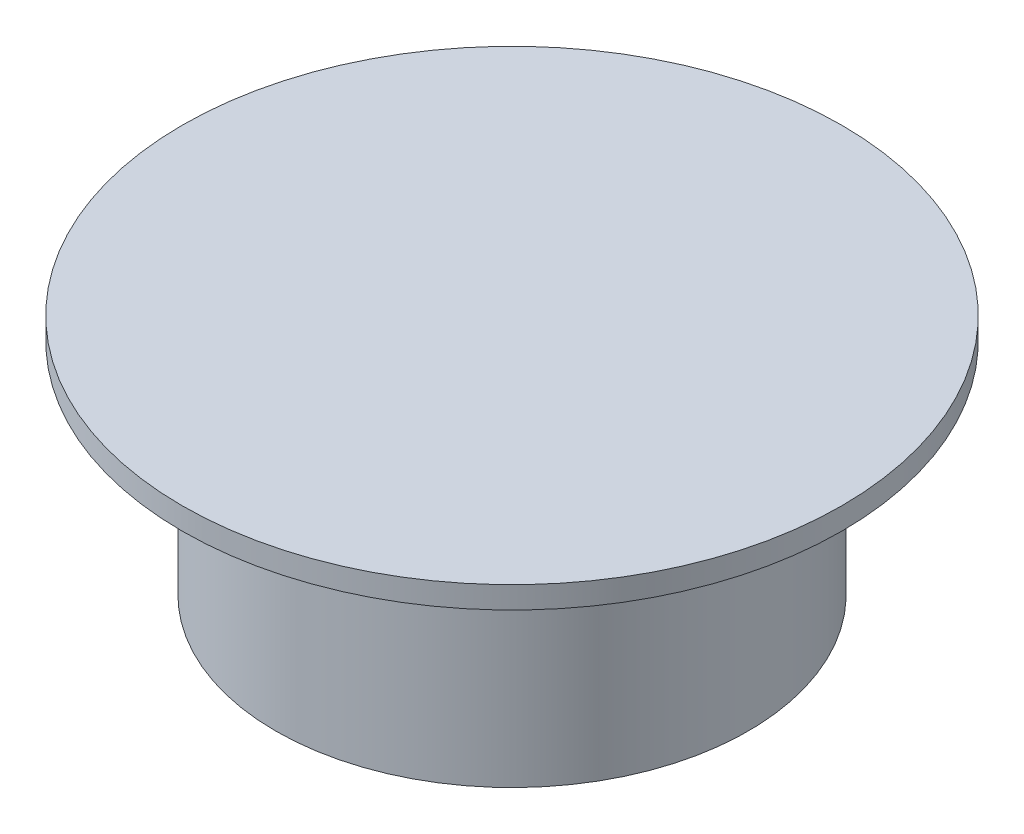
ISO-10303-21;
HEADER;
FILE_DESCRIPTION(('STEP AP214'),'2;1');
FILE_NAME('part.step','',(''),(''),'','','');
FILE_SCHEMA(('AUTOMOTIVE_DESIGN { 1 0 10303 214 1 1 1 1 }'));
ENDSEC;
DATA;
#1=APPLICATION_CONTEXT('core data for automotive mechanical design processes');
#2=APPLICATION_PROTOCOL_DEFINITION('international standard','automotive_design',2000,#1);
#3=PRODUCT_CONTEXT('',#1,'mechanical');
#4=PRODUCT('Part','Part','',(#3));
#5=PRODUCT_RELATED_PRODUCT_CATEGORY('part','',(#4));
#6=PRODUCT_DEFINITION_FORMATION('','',#4);
#7=PRODUCT_DEFINITION_CONTEXT('part definition',#1,'design');
#8=PRODUCT_DEFINITION('design','',#6,#7);
#9=PRODUCT_DEFINITION_SHAPE('','',#8);
#10=(LENGTH_UNIT() NAMED_UNIT(*) SI_UNIT(.MILLI.,.METRE.));
#11=(NAMED_UNIT(*) PLANE_ANGLE_UNIT() SI_UNIT($,.RADIAN.));
#12=(NAMED_UNIT(*) SI_UNIT($,.STERADIAN.) SOLID_ANGLE_UNIT());
#13=UNCERTAINTY_MEASURE_WITH_UNIT(LENGTH_MEASURE(1.E-05),#10,'distance_accuracy_value','');
#14=(GEOMETRIC_REPRESENTATION_CONTEXT(3) GLOBAL_UNCERTAINTY_ASSIGNED_CONTEXT((#13)) GLOBAL_UNIT_ASSIGNED_CONTEXT((#10,
#11,#12)) REPRESENTATION_CONTEXT('',''));
#15=CARTESIAN_POINT('',(0.,0.,0.));
#16=DIRECTION('',(0.,0.,1.));
#17=DIRECTION('',(1.,0.,0.));
#18=AXIS2_PLACEMENT_3D('',#15,#16,#17);
#19=CARTESIAN_POINT('',(0.,10.,0.));
#20=DIRECTION('',(0.,-1.,0.));
#21=DIRECTION('',(0.,0.,-1.));
#22=AXIS2_PLACEMENT_3D('',#19,#20,#21);
#23=CYLINDRICAL_SURFACE('',#22,10.75);
#24=CARTESIAN_POINT('',(0.,10.,0.));
#25=DIRECTION('',(0.,1.,0.));
#26=DIRECTION('',(0.,0.,1.));
#27=AXIS2_PLACEMENT_3D('',#24,#25,#26);
#28=CIRCLE('',#27,10.75);
#29=CARTESIAN_POINT('',(0.,10.,10.75));
#30=VERTEX_POINT('',#29);
#31=EDGE_CURVE('E10',#30,#30,#28,.T.);
#32=ORIENTED_EDGE('',*,*,#31,.F.);
#33=EDGE_LOOP('',(#32));
#34=FACE_BOUND('',#33,.T.);
#35=CARTESIAN_POINT('',(0.,0.,0.));
#36=DIRECTION('',(0.,1.,0.));
#37=DIRECTION('',(0.,0.,1.));
#38=AXIS2_PLACEMENT_3D('',#35,#36,#37);
#39=CIRCLE('',#38,10.75);
#40=CARTESIAN_POINT('',(0.,0.,10.75));
#41=VERTEX_POINT('',#40);
#42=EDGE_CURVE('E40',#41,#41,#39,.T.);
#43=ORIENTED_EDGE('',*,*,#42,.T.);
#44=EDGE_LOOP('',(#43));
#45=FACE_BOUND('',#44,.T.);
#46=ADVANCED_FACE('F37',(#34,#45),#23,.T.);
#47=CARTESIAN_POINT('',(0.,0.,0.));
#48=DIRECTION('',(0.,1.,0.));
#49=DIRECTION('',(0.,0.,1.));
#50=AXIS2_PLACEMENT_3D('',#47,#48,#49);
#51=PLANE('',#50);
#52=ORIENTED_EDGE('',*,*,#42,.F.);
#53=EDGE_LOOP('',(#52));
#54=FACE_BOUND('',#53,.T.);
#55=ADVANCED_FACE('F64',(#54),#51,.F.);
#56=CARTESIAN_POINT('',(0.,11.,0.));
#57=DIRECTION('',(0.,-1.,0.));
#58=DIRECTION('',(0.,0.,-1.));
#59=AXIS2_PLACEMENT_3D('',#56,#57,#58);
#60=CYLINDRICAL_SURFACE('',#59,15.);
#61=CARTESIAN_POINT('',(0.,11.,0.));
#62=DIRECTION('',(0.,1.,0.));
#63=DIRECTION('',(0.,0.,1.));
#64=AXIS2_PLACEMENT_3D('',#61,#62,#63);
#65=CIRCLE('',#64,15.);
#66=CARTESIAN_POINT('',(0.,11.,15.));
#67=VERTEX_POINT('',#66);
#68=EDGE_CURVE('E49',#67,#67,#65,.T.);
#69=ORIENTED_EDGE('',*,*,#68,.F.);
#70=EDGE_LOOP('',(#69));
#71=FACE_BOUND('',#70,.T.);
#72=CARTESIAN_POINT('',(0.,10.,0.));
#73=DIRECTION('',(0.,1.,0.));
#74=DIRECTION('',(0.,0.,1.));
#75=AXIS2_PLACEMENT_3D('',#72,#73,#74);
#76=CIRCLE('',#75,15.);
#77=CARTESIAN_POINT('',(0.,10.,15.));
#78=VERTEX_POINT('',#77);
#79=EDGE_CURVE('E51',#78,#78,#76,.T.);
#80=ORIENTED_EDGE('',*,*,#79,.T.);
#81=EDGE_LOOP('',(#80));
#82=FACE_BOUND('',#81,.T.);
#83=ADVANCED_FACE('F61',(#71,#82),#60,.T.);
#84=CARTESIAN_POINT('',(0.,11.,0.));
#85=DIRECTION('',(0.,1.,0.));
#86=DIRECTION('',(0.,0.,1.));
#87=AXIS2_PLACEMENT_3D('',#84,#85,#86);
#88=PLANE('',#87);
#89=ORIENTED_EDGE('',*,*,#68,.T.);
#90=EDGE_LOOP('',(#89));
#91=FACE_BOUND('',#90,.T.);
#92=ADVANCED_FACE('F59',(#91),#88,.T.);
#93=CARTESIAN_POINT('',(0.,10.,0.));
#94=DIRECTION('',(0.,1.,0.));
#95=DIRECTION('',(0.,0.,1.));
#96=AXIS2_PLACEMENT_3D('',#93,#94,#95);
#97=PLANE('',#96);
#98=ORIENTED_EDGE('',*,*,#31,.T.);
#99=EDGE_LOOP('',(#98));
#100=FACE_BOUND('',#99,.T.);
#101=ORIENTED_EDGE('',*,*,#79,.F.);
#102=EDGE_LOOP('',(#101));
#103=FACE_BOUND('',#102,.T.);
#104=ADVANCED_FACE('F68',(#100,#103),#97,.F.);
#105=CLOSED_SHELL('',(#46,#55,#83,#92,#104));
#106=MANIFOLD_SOLID_BREP('B2',#105);
#107=ADVANCED_BREP_SHAPE_REPRESENTATION('',(#18,#106),#14);
#108=SHAPE_DEFINITION_REPRESENTATION(#9,#107);
ENDSEC;
END-ISO-10303-21;
